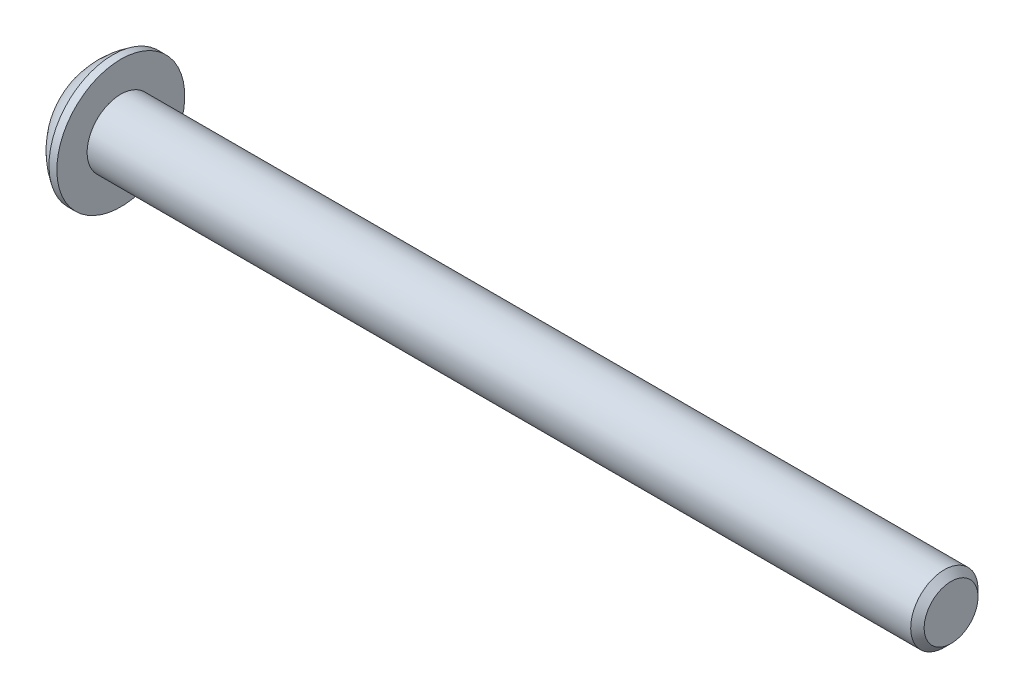
ISO-10303-21;
HEADER;
FILE_DESCRIPTION(('STEP AP214'),'2;1');
FILE_NAME('part.step','',(''),(''),'','','');
FILE_SCHEMA(('AUTOMOTIVE_DESIGN { 1 0 10303 214 1 1 1 1 }'));
ENDSEC;
DATA;
#1=APPLICATION_CONTEXT('core data for automotive mechanical design processes');
#2=APPLICATION_PROTOCOL_DEFINITION('international standard','automotive_design',2000,#1);
#3=PRODUCT_CONTEXT('',#1,'mechanical');
#4=PRODUCT('Part','Part','',(#3));
#5=PRODUCT_RELATED_PRODUCT_CATEGORY('part','',(#4));
#6=PRODUCT_DEFINITION_FORMATION('','',#4);
#7=PRODUCT_DEFINITION_CONTEXT('part definition',#1,'design');
#8=PRODUCT_DEFINITION('design','',#6,#7);
#9=PRODUCT_DEFINITION_SHAPE('','',#8);
#10=(LENGTH_UNIT() NAMED_UNIT(*) SI_UNIT(.MILLI.,.METRE.));
#11=(NAMED_UNIT(*) PLANE_ANGLE_UNIT() SI_UNIT($,.RADIAN.));
#12=(NAMED_UNIT(*) SI_UNIT($,.STERADIAN.) SOLID_ANGLE_UNIT());
#13=UNCERTAINTY_MEASURE_WITH_UNIT(LENGTH_MEASURE(1.E-05),#10,'distance_accuracy_value','');
#14=(GEOMETRIC_REPRESENTATION_CONTEXT(3) GLOBAL_UNCERTAINTY_ASSIGNED_CONTEXT((#13)) GLOBAL_UNIT_ASSIGNED_CONTEXT((#10,
#11,#12)) REPRESENTATION_CONTEXT('',''));
#15=CARTESIAN_POINT('',(0.,0.,0.));
#16=DIRECTION('',(0.,0.,1.));
#17=DIRECTION('',(1.,0.,0.));
#18=AXIS2_PLACEMENT_3D('',#15,#16,#17);
#19=CARTESIAN_POINT('',(38.65,1.50000000000001,0.));
#20=DIRECTION('',(1.,0.,0.));
#21=DIRECTION('',(0.,1.,0.));
#22=AXIS2_PLACEMENT_3D('',#19,#20,#21);
#23=PLANE('',#22);
#24=CARTESIAN_POINT('',(38.65,0.,0.));
#25=DIRECTION('',(1.,0.,0.));
#26=DIRECTION('',(0.,1.,0.));
#27=AXIS2_PLACEMENT_3D('',#24,#25,#26);
#28=CIRCLE('',#27,1.2);
#29=CARTESIAN_POINT('',(38.65,1.20000000000001,0.));
#30=VERTEX_POINT('',#29);
#31=EDGE_CURVE('E52',#30,#30,#28,.T.);
#32=ORIENTED_EDGE('',*,*,#31,.T.);
#33=EDGE_LOOP('',(#32));
#34=FACE_BOUND('',#33,.T.);
#35=ADVANCED_FACE('F43',(#34),#23,.T.);
#36=CARTESIAN_POINT('',(0.,0.,0.));
#37=DIRECTION('',(-1.,0.,0.));
#38=DIRECTION('',(0.,-1.,0.));
#39=AXIS2_PLACEMENT_3D('',#36,#37,#38);
#40=PLANE('',#39);
#41=DIRECTION('',(0.,0.5,-0.866025403784439));
#42=VECTOR('',#41,1.);
#43=CARTESIAN_POINT('',(0.,0.577350269189626,1.));
#44=LINE('',#43,#42);
#45=CARTESIAN_POINT('',(0.,0.577350269189626,1.));
#46=VERTEX_POINT('',#45);
#47=CARTESIAN_POINT('',(0.,1.15470053837925,0.));
#48=VERTEX_POINT('',#47);
#49=EDGE_CURVE('E59',#46,#48,#44,.T.);
#50=ORIENTED_EDGE('',*,*,#49,.F.);
#51=DIRECTION('',(0.,1.,0.));
#52=VECTOR('',#51,1.);
#53=CARTESIAN_POINT('',(0.,-0.577350269189626,1.));
#54=LINE('',#53,#52);
#55=CARTESIAN_POINT('',(0.,-0.577350269189626,1.));
#56=VERTEX_POINT('',#55);
#57=EDGE_CURVE('E142',#56,#46,#54,.T.);
#58=ORIENTED_EDGE('',*,*,#57,.F.);
#59=DIRECTION('',(0.,0.5,0.866025403784439));
#60=VECTOR('',#59,1.);
#61=CARTESIAN_POINT('',(0.,-1.15470053837925,0.));
#62=LINE('',#61,#60);
#63=CARTESIAN_POINT('',(0.,-1.15470053837925,0.));
#64=VERTEX_POINT('',#63);
#65=EDGE_CURVE('E140',#64,#56,#62,.T.);
#66=ORIENTED_EDGE('',*,*,#65,.F.);
#67=DIRECTION('',(0.,-0.5,0.866025403784439));
#68=VECTOR('',#67,1.);
#69=CARTESIAN_POINT('',(0.,-0.577350269189626,-1.));
#70=LINE('',#69,#68);
#71=CARTESIAN_POINT('',(0.,-0.577350269189626,-1.));
#72=VERTEX_POINT('',#71);
#73=EDGE_CURVE('E107',#72,#64,#70,.T.);
#74=ORIENTED_EDGE('',*,*,#73,.F.);
#75=DIRECTION('',(0.,-1.,0.));
#76=VECTOR('',#75,1.);
#77=CARTESIAN_POINT('',(0.,0.577350269189626,-1.));
#78=LINE('',#77,#76);
#79=CARTESIAN_POINT('',(0.,0.577350269189626,-1.));
#80=VERTEX_POINT('',#79);
#81=EDGE_CURVE('E136',#80,#72,#78,.T.);
#82=ORIENTED_EDGE('',*,*,#81,.F.);
#83=DIRECTION('',(0.,-0.5,-0.866025403784439));
#84=VECTOR('',#83,1.);
#85=CARTESIAN_POINT('',(0.,1.15470053837925,0.));
#86=LINE('',#85,#84);
#87=EDGE_CURVE('E133',#48,#80,#86,.T.);
#88=ORIENTED_EDGE('',*,*,#87,.F.);
#89=EDGE_LOOP('',(#50,#58,#66,#74,#82,#88));
#90=FACE_BOUND('',#89,.T.);
#91=CARTESIAN_POINT('',(0.,0.,0.));
#92=DIRECTION('',(1.,0.,0.));
#93=DIRECTION('',(0.,1.,0.));
#94=AXIS2_PLACEMENT_3D('',#91,#92,#93);
#95=CIRCLE('',#94,1.425);
#96=CARTESIAN_POINT('',(0.,1.425,0.));
#97=VERTEX_POINT('',#96);
#98=EDGE_CURVE('E160',#97,#97,#95,.T.);
#99=ORIENTED_EDGE('',*,*,#98,.F.);
#100=EDGE_LOOP('',(#99));
#101=FACE_BOUND('',#100,.T.);
#102=ADVANCED_FACE('F181',(#90,#101),#40,.T.);
#103=CARTESIAN_POINT('',(3.13557647887669,0.,0.));
#104=DIRECTION('',(1.,0.,0.));
#105=DIRECTION('',(0.,1.,0.));
#106=AXIS2_PLACEMENT_3D('',#103,#104,#105);
#107=DEGENERATE_TOROIDAL_SURFACE('',#106,0.130043454413828,3.5,.F.);
#108=ORIENTED_EDGE('',*,*,#98,.T.);
#109=EDGE_LOOP('',(#108));
#110=FACE_BOUND('',#109,.T.);
#111=CARTESIAN_POINT('',(1.3,0.,0.));
#112=DIRECTION('',(1.,0.,0.));
#113=DIRECTION('',(0.,1.,0.));
#114=AXIS2_PLACEMENT_3D('',#111,#112,#113);
#115=CIRCLE('',#114,2.85);
#116=CARTESIAN_POINT('',(1.3,2.85,0.));
#117=VERTEX_POINT('',#116);
#118=EDGE_CURVE('E157',#117,#117,#115,.T.);
#119=ORIENTED_EDGE('',*,*,#118,.F.);
#120=EDGE_LOOP('',(#119));
#121=FACE_BOUND('',#120,.T.);
#122=ADVANCED_FACE('F185',(#110,#121),#107,.F.);
#123=CARTESIAN_POINT('',(38.65,0.,0.));
#124=DIRECTION('',(1.,0.,0.));
#125=DIRECTION('',(0.,1.,0.));
#126=AXIS2_PLACEMENT_3D('',#123,#124,#125);
#127=CYLINDRICAL_SURFACE('',#126,2.85);
#128=ORIENTED_EDGE('',*,*,#118,.T.);
#129=EDGE_LOOP('',(#128));
#130=FACE_BOUND('',#129,.T.);
#131=CARTESIAN_POINT('',(1.65,0.,0.));
#132=DIRECTION('',(1.,0.,0.));
#133=DIRECTION('',(0.,1.,0.));
#134=AXIS2_PLACEMENT_3D('',#131,#132,#133);
#135=CIRCLE('',#134,2.84999999999999);
#136=CARTESIAN_POINT('',(1.65,2.85,0.));
#137=VERTEX_POINT('',#136);
#138=EDGE_CURVE('E154',#137,#137,#135,.T.);
#139=ORIENTED_EDGE('',*,*,#138,.F.);
#140=EDGE_LOOP('',(#139));
#141=FACE_BOUND('',#140,.T.);
#142=ADVANCED_FACE('F191',(#130,#141),#127,.T.);
#143=CARTESIAN_POINT('',(1.65,2.85,0.));
#144=DIRECTION('',(1.,0.,0.));
#145=DIRECTION('',(0.,1.,0.));
#146=AXIS2_PLACEMENT_3D('',#143,#144,#145);
#147=PLANE('',#146);
#148=ORIENTED_EDGE('',*,*,#138,.T.);
#149=EDGE_LOOP('',(#148));
#150=FACE_BOUND('',#149,.T.);
#151=CARTESIAN_POINT('',(1.65,0.,0.));
#152=DIRECTION('',(1.,0.,0.));
#153=DIRECTION('',(0.,1.,0.));
#154=AXIS2_PLACEMENT_3D('',#151,#152,#153);
#155=CIRCLE('',#154,1.5);
#156=CARTESIAN_POINT('',(1.65,1.5,0.));
#157=VERTEX_POINT('',#156);
#158=EDGE_CURVE('E146',#157,#157,#155,.T.);
#159=ORIENTED_EDGE('',*,*,#158,.F.);
#160=EDGE_LOOP('',(#159));
#161=FACE_BOUND('',#160,.T.);
#162=ADVANCED_FACE('F176',(#150,#161),#147,.T.);
#163=CARTESIAN_POINT('',(38.65,0.,0.));
#164=DIRECTION('',(1.,0.,0.));
#165=DIRECTION('',(0.,1.,0.));
#166=AXIS2_PLACEMENT_3D('',#163,#164,#165);
#167=CYLINDRICAL_SURFACE('',#166,1.5);
#168=CARTESIAN_POINT('',(38.35,0.,0.));
#169=DIRECTION('',(1.,0.,0.));
#170=DIRECTION('',(0.,1.,0.));
#171=AXIS2_PLACEMENT_3D('',#168,#169,#170);
#172=CIRCLE('',#171,1.5);
#173=CARTESIAN_POINT('',(38.35,1.50000000000001,0.));
#174=VERTEX_POINT('',#173);
#175=EDGE_CURVE('E11',#174,#174,#172,.F.);
#176=ORIENTED_EDGE('',*,*,#175,.T.);
#177=EDGE_LOOP('',(#176));
#178=FACE_BOUND('',#177,.T.);
#179=ORIENTED_EDGE('',*,*,#158,.T.);
#180=EDGE_LOOP('',(#179));
#181=FACE_BOUND('',#180,.T.);
#182=ADVANCED_FACE('F168',(#178,#181),#167,.T.);
#183=CARTESIAN_POINT('',(38.65,0.,0.));
#184=DIRECTION('',(-1.,0.,0.));
#185=DIRECTION('',(0.,-1.,0.));
#186=AXIS2_PLACEMENT_3D('',#183,#184,#185);
#187=CONICAL_SURFACE('',#186,1.2,0.785398163397452);
#188=ORIENTED_EDGE('',*,*,#175,.F.);
#189=EDGE_LOOP('',(#188));
#190=FACE_BOUND('',#189,.T.);
#191=ORIENTED_EDGE('',*,*,#31,.F.);
#192=EDGE_LOOP('',(#191));
#193=FACE_BOUND('',#192,.T.);
#194=ADVANCED_FACE('F46',(#190,#193),#187,.T.);
#195=CARTESIAN_POINT('',(1.,0.577350269189627,1.));
#196=DIRECTION('',(0.,0.866025403784438,0.5));
#197=DIRECTION('',(0.,-0.5,0.866025403784439));
#198=AXIS2_PLACEMENT_3D('',#195,#196,#197);
#199=PLANE('',#198);
#200=ORIENTED_EDGE('',*,*,#49,.T.);
#201=DIRECTION('',(-1.,0.,0.));
#202=VECTOR('',#201,1.);
#203=CARTESIAN_POINT('',(1.,1.15470053837925,0.));
#204=LINE('',#203,#202);
#205=CARTESIAN_POINT('',(1.,1.15470053837925,0.));
#206=VERTEX_POINT('',#205);
#207=EDGE_CURVE('E89',#206,#48,#204,.T.);
#208=ORIENTED_EDGE('',*,*,#207,.F.);
#209=DIRECTION('',(0.,0.5,-0.866025403784439));
#210=VECTOR('',#209,1.);
#211=CARTESIAN_POINT('',(1.,0.577350269189627,1.));
#212=LINE('',#211,#210);
#213=CARTESIAN_POINT('',(1.,0.577350269189627,1.));
#214=VERTEX_POINT('',#213);
#215=EDGE_CURVE('E144',#214,#206,#212,.T.);
#216=ORIENTED_EDGE('',*,*,#215,.F.);
#217=DIRECTION('',(-1.,0.,0.));
#218=VECTOR('',#217,1.);
#219=CARTESIAN_POINT('',(1.,0.577350269189627,1.));
#220=LINE('',#219,#218);
#221=EDGE_CURVE('E67',#214,#46,#220,.T.);
#222=ORIENTED_EDGE('',*,*,#221,.T.);
#223=EDGE_LOOP('',(#200,#208,#216,#222));
#224=FACE_BOUND('',#223,.T.);
#225=ADVANCED_FACE('F167',(#224),#199,.F.);
#226=CARTESIAN_POINT('',(1.,-0.577350269189626,1.));
#227=DIRECTION('',(0.,0.,1.));
#228=DIRECTION('',(0.,-1.,0.));
#229=AXIS2_PLACEMENT_3D('',#226,#227,#228);
#230=PLANE('',#229);
#231=ORIENTED_EDGE('',*,*,#57,.T.);
#232=ORIENTED_EDGE('',*,*,#221,.F.);
#233=DIRECTION('',(0.,1.,0.));
#234=VECTOR('',#233,1.);
#235=CARTESIAN_POINT('',(1.,-0.577350269189626,1.));
#236=LINE('',#235,#234);
#237=CARTESIAN_POINT('',(1.,-0.577350269189626,1.));
#238=VERTEX_POINT('',#237);
#239=EDGE_CURVE('E119',#238,#214,#236,.T.);
#240=ORIENTED_EDGE('',*,*,#239,.F.);
#241=DIRECTION('',(-1.,0.,0.));
#242=VECTOR('',#241,1.);
#243=CARTESIAN_POINT('',(1.,-0.577350269189626,1.));
#244=LINE('',#243,#242);
#245=EDGE_CURVE('E111',#238,#56,#244,.T.);
#246=ORIENTED_EDGE('',*,*,#245,.T.);
#247=EDGE_LOOP('',(#231,#232,#240,#246));
#248=FACE_BOUND('',#247,.T.);
#249=ADVANCED_FACE('F174',(#248),#230,.F.);
#250=CARTESIAN_POINT('',(1.,-1.15470053837925,0.));
#251=DIRECTION('',(0.,-0.866025403784439,0.5));
#252=DIRECTION('',(0.,-0.5,-0.866025403784439));
#253=AXIS2_PLACEMENT_3D('',#250,#251,#252);
#254=PLANE('',#253);
#255=ORIENTED_EDGE('',*,*,#65,.T.);
#256=ORIENTED_EDGE('',*,*,#245,.F.);
#257=DIRECTION('',(0.,0.5,0.866025403784439));
#258=VECTOR('',#257,1.);
#259=CARTESIAN_POINT('',(1.,-1.15470053837925,0.));
#260=LINE('',#259,#258);
#261=CARTESIAN_POINT('',(1.,-1.15470053837925,0.));
#262=VERTEX_POINT('',#261);
#263=EDGE_CURVE('E115',#262,#238,#260,.T.);
#264=ORIENTED_EDGE('',*,*,#263,.F.);
#265=DIRECTION('',(-1.,0.,0.));
#266=VECTOR('',#265,1.);
#267=CARTESIAN_POINT('',(1.,-1.15470053837925,0.));
#268=LINE('',#267,#266);
#269=EDGE_CURVE('E100',#262,#64,#268,.T.);
#270=ORIENTED_EDGE('',*,*,#269,.T.);
#271=EDGE_LOOP('',(#255,#256,#264,#270));
#272=FACE_BOUND('',#271,.T.);
#273=ADVANCED_FACE('F116',(#272),#254,.F.);
#274=CARTESIAN_POINT('',(1.,-0.577350269189626,-1.));
#275=DIRECTION('',(0.,-0.866025403784438,-0.5));
#276=DIRECTION('',(0.,0.5,-0.866025403784439));
#277=AXIS2_PLACEMENT_3D('',#274,#275,#276);
#278=PLANE('',#277);
#279=ORIENTED_EDGE('',*,*,#73,.T.);
#280=ORIENTED_EDGE('',*,*,#269,.F.);
#281=DIRECTION('',(0.,-0.5,0.866025403784439));
#282=VECTOR('',#281,1.);
#283=CARTESIAN_POINT('',(1.,-0.577350269189626,-1.));
#284=LINE('',#283,#282);
#285=CARTESIAN_POINT('',(1.,-0.577350269189626,-1.));
#286=VERTEX_POINT('',#285);
#287=EDGE_CURVE('E104',#286,#262,#284,.T.);
#288=ORIENTED_EDGE('',*,*,#287,.F.);
#289=DIRECTION('',(-1.,0.,0.));
#290=VECTOR('',#289,1.);
#291=CARTESIAN_POINT('',(1.,-0.577350269189626,-1.));
#292=LINE('',#291,#290);
#293=EDGE_CURVE('E112',#286,#72,#292,.T.);
#294=ORIENTED_EDGE('',*,*,#293,.T.);
#295=EDGE_LOOP('',(#279,#280,#288,#294));
#296=FACE_BOUND('',#295,.T.);
#297=ADVANCED_FACE('F102',(#296),#278,.F.);
#298=CARTESIAN_POINT('',(1.,0.577350269189627,-1.));
#299=DIRECTION('',(0.,0.,-1.));
#300=DIRECTION('',(0.,1.,0.));
#301=AXIS2_PLACEMENT_3D('',#298,#299,#300);
#302=PLANE('',#301);
#303=ORIENTED_EDGE('',*,*,#81,.T.);
#304=ORIENTED_EDGE('',*,*,#293,.F.);
#305=DIRECTION('',(0.,-1.,0.));
#306=VECTOR('',#305,1.);
#307=CARTESIAN_POINT('',(1.,0.577350269189627,-1.));
#308=LINE('',#307,#306);
#309=CARTESIAN_POINT('',(1.,0.577350269189627,-1.));
#310=VERTEX_POINT('',#309);
#311=EDGE_CURVE('E125',#310,#286,#308,.T.);
#312=ORIENTED_EDGE('',*,*,#311,.F.);
#313=DIRECTION('',(-1.,0.,0.));
#314=VECTOR('',#313,1.);
#315=CARTESIAN_POINT('',(1.,0.577350269189627,-1.));
#316=LINE('',#315,#314);
#317=EDGE_CURVE('E149',#310,#80,#316,.T.);
#318=ORIENTED_EDGE('',*,*,#317,.T.);
#319=EDGE_LOOP('',(#303,#304,#312,#318));
#320=FACE_BOUND('',#319,.T.);
#321=ADVANCED_FACE('F202',(#320),#302,.F.);
#322=CARTESIAN_POINT('',(1.,1.15470053837925,0.));
#323=DIRECTION('',(0.,0.866025403784439,-0.5));
#324=DIRECTION('',(0.,0.5,0.866025403784439));
#325=AXIS2_PLACEMENT_3D('',#322,#323,#324);
#326=PLANE('',#325);
#327=ORIENTED_EDGE('',*,*,#87,.T.);
#328=ORIENTED_EDGE('',*,*,#317,.F.);
#329=DIRECTION('',(0.,-0.5,-0.866025403784439));
#330=VECTOR('',#329,1.);
#331=CARTESIAN_POINT('',(1.,1.15470053837925,0.));
#332=LINE('',#331,#330);
#333=EDGE_CURVE('E127',#206,#310,#332,.T.);
#334=ORIENTED_EDGE('',*,*,#333,.F.);
#335=ORIENTED_EDGE('',*,*,#207,.T.);
#336=EDGE_LOOP('',(#327,#328,#334,#335));
#337=FACE_BOUND('',#336,.T.);
#338=ADVANCED_FACE('F199',(#337),#326,.F.);
#339=CARTESIAN_POINT('',(1.,0.,0.));
#340=DIRECTION('',(-1.,0.,0.));
#341=DIRECTION('',(0.,-1.,0.));
#342=AXIS2_PLACEMENT_3D('',#339,#340,#341);
#343=PLANE('',#342);
#344=ORIENTED_EDGE('',*,*,#215,.T.);
#345=ORIENTED_EDGE('',*,*,#333,.T.);
#346=ORIENTED_EDGE('',*,*,#311,.T.);
#347=ORIENTED_EDGE('',*,*,#287,.T.);
#348=ORIENTED_EDGE('',*,*,#263,.T.);
#349=ORIENTED_EDGE('',*,*,#239,.T.);
#350=EDGE_LOOP('',(#344,#345,#346,#347,#348,#349));
#351=FACE_BOUND('',#350,.T.);
#352=ADVANCED_FACE('F122',(#351),#343,.T.);
#353=CLOSED_SHELL('',(#35,#102,#122,#142,#162,#182,#194,#225,#249,#273,#297,#321,#338,#352));
#354=MANIFOLD_SOLID_BREP('B2',#353);
#355=ADVANCED_BREP_SHAPE_REPRESENTATION('',(#18,#354),#14);
#356=SHAPE_DEFINITION_REPRESENTATION(#9,#355);
ENDSEC;
END-ISO-10303-21;
